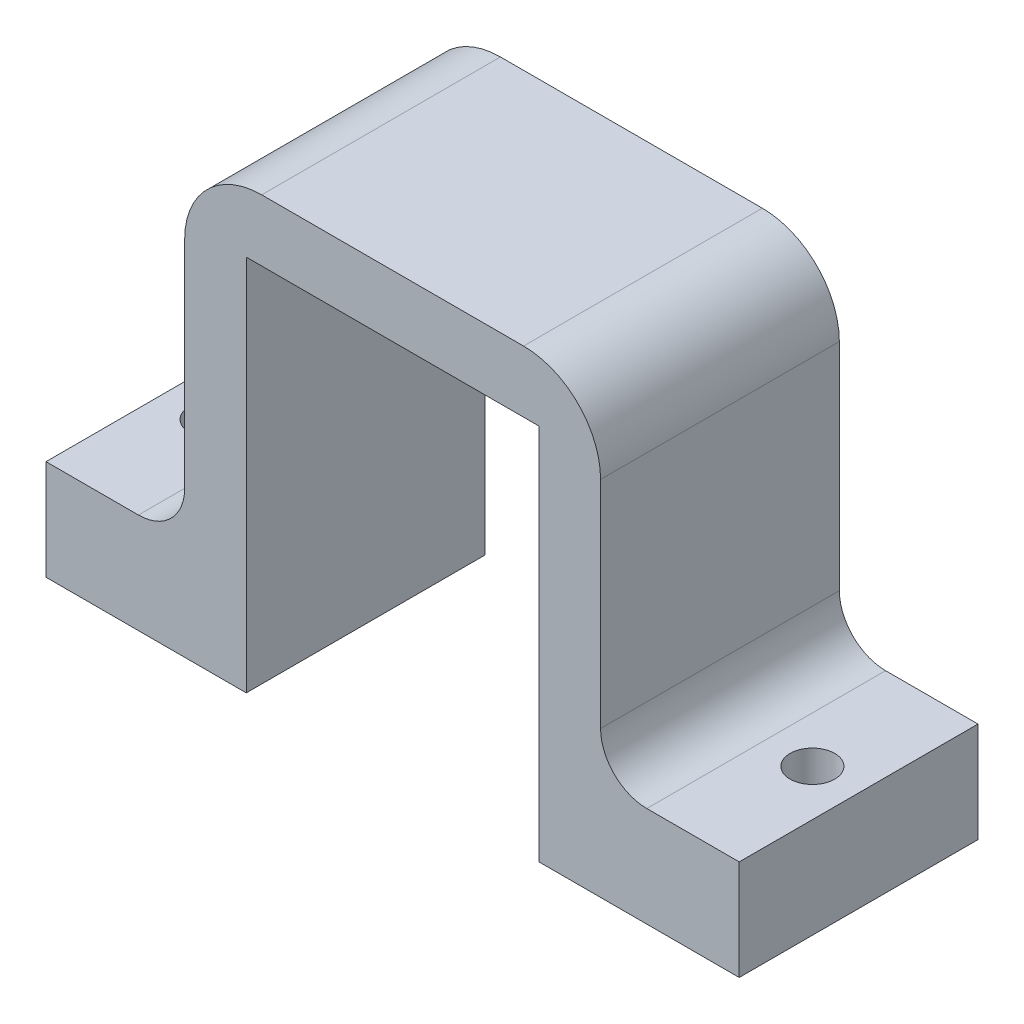
ISO-10303-21;
HEADER;
FILE_DESCRIPTION(('STEP AP214'),'2;1');
FILE_NAME('part.step','',(''),(''),'','','');
FILE_SCHEMA(('AUTOMOTIVE_DESIGN { 1 0 10303 214 1 1 1 1 }'));
ENDSEC;
DATA;
#1=APPLICATION_CONTEXT('core data for automotive mechanical design processes');
#2=APPLICATION_PROTOCOL_DEFINITION('international standard','automotive_design',2000,#1);
#3=PRODUCT_CONTEXT('',#1,'mechanical');
#4=PRODUCT('Part','Part','',(#3));
#5=PRODUCT_RELATED_PRODUCT_CATEGORY('part','',(#4));
#6=PRODUCT_DEFINITION_FORMATION('','',#4);
#7=PRODUCT_DEFINITION_CONTEXT('part definition',#1,'design');
#8=PRODUCT_DEFINITION('design','',#6,#7);
#9=PRODUCT_DEFINITION_SHAPE('','',#8);
#10=(LENGTH_UNIT() NAMED_UNIT(*) SI_UNIT(.MILLI.,.METRE.));
#11=(NAMED_UNIT(*) PLANE_ANGLE_UNIT() SI_UNIT($,.RADIAN.));
#12=(NAMED_UNIT(*) SI_UNIT($,.STERADIAN.) SOLID_ANGLE_UNIT());
#13=UNCERTAINTY_MEASURE_WITH_UNIT(LENGTH_MEASURE(1.E-05),#10,'distance_accuracy_value','');
#14=(GEOMETRIC_REPRESENTATION_CONTEXT(3) GLOBAL_UNCERTAINTY_ASSIGNED_CONTEXT((#13)) GLOBAL_UNIT_ASSIGNED_CONTEXT((#10,
#11,#12)) REPRESENTATION_CONTEXT('',''));
#15=CARTESIAN_POINT('',(0.,0.,0.));
#16=DIRECTION('',(0.,0.,1.));
#17=DIRECTION('',(1.,0.,0.));
#18=AXIS2_PLACEMENT_3D('',#15,#16,#17);
#19=CARTESIAN_POINT('',(0.,3.00000000000002,23.));
#20=DIRECTION('',(1.,0.,0.));
#21=DIRECTION('',(0.,0.,-1.));
#22=AXIS2_PLACEMENT_3D('',#19,#20,#21);
#23=PLANE('',#22);
#24=DIRECTION('',(0.,1.,0.));
#25=VECTOR('',#24,1.);
#26=CARTESIAN_POINT('',(0.,3.00000000000002,7.5));
#27=LINE('',#26,#25);
#28=CARTESIAN_POINT('',(0.,3.00000000000002,7.5));
#29=VERTEX_POINT('',#28);
#30=CARTESIAN_POINT('',(0.,17.,7.5));
#31=VERTEX_POINT('',#30);
#32=EDGE_CURVE('E254',#29,#31,#27,.T.);
#33=ORIENTED_EDGE('',*,*,#32,.F.);
#34=DIRECTION('',(0.,0.,-1.));
#35=VECTOR('',#34,1.);
#36=CARTESIAN_POINT('',(0.,3.00000000000002,23.));
#37=LINE('',#36,#35);
#38=CARTESIAN_POINT('',(0.,3.00000000000002,23.));
#39=VERTEX_POINT('',#38);
#40=EDGE_CURVE('E312',#39,#29,#37,.T.);
#41=ORIENTED_EDGE('',*,*,#40,.F.);
#42=DIRECTION('',(0.,-1.,0.));
#43=VECTOR('',#42,1.);
#44=CARTESIAN_POINT('',(0.,3.00000000000002,23.));
#45=LINE('',#44,#43);
#46=CARTESIAN_POINT('',(0.,17.,23.));
#47=VERTEX_POINT('',#46);
#48=EDGE_CURVE('E279',#47,#39,#45,.T.);
#49=ORIENTED_EDGE('',*,*,#48,.F.);
#50=DIRECTION('',(0.,0.,-1.));
#51=VECTOR('',#50,1.);
#52=CARTESIAN_POINT('',(0.,17.,23.));
#53=LINE('',#52,#51);
#54=EDGE_CURVE('E316',#47,#31,#53,.T.);
#55=ORIENTED_EDGE('',*,*,#54,.T.);
#56=EDGE_LOOP('',(#33,#41,#49,#55));
#57=FACE_BOUND('',#56,.T.);
#58=ADVANCED_FACE('F45',(#57),#23,.F.);
#59=CARTESIAN_POINT('',(-3.,3.,23.));
#60=DIRECTION('',(0.,0.,-1.));
#61=DIRECTION('',(-1.,0.,0.));
#62=AXIS2_PLACEMENT_3D('',#59,#60,#61);
#63=CYLINDRICAL_SURFACE('',#62,3.);
#64=CARTESIAN_POINT('',(-3.,3.,7.5));
#65=DIRECTION('',(0.,0.,-1.));
#66=DIRECTION('',(0.,1.,0.));
#67=AXIS2_PLACEMENT_3D('',#64,#65,#66);
#68=CIRCLE('',#67,3.);
#69=CARTESIAN_POINT('',(-3.00000000000002,0.,7.5));
#70=VERTEX_POINT('',#69);
#71=EDGE_CURVE('E251',#70,#29,#68,.F.);
#72=ORIENTED_EDGE('',*,*,#71,.F.);
#73=DIRECTION('',(0.,0.,-1.));
#74=VECTOR('',#73,1.);
#75=CARTESIAN_POINT('',(-3.00000000000002,0.,23.));
#76=LINE('',#75,#74);
#77=CARTESIAN_POINT('',(-3.00000000000002,0.,23.));
#78=VERTEX_POINT('',#77);
#79=EDGE_CURVE('E308',#78,#70,#76,.T.);
#80=ORIENTED_EDGE('',*,*,#79,.F.);
#81=CARTESIAN_POINT('',(-3.,3.,23.));
#82=DIRECTION('',(0.,0.,-1.));
#83=DIRECTION('',(-1.,0.,0.));
#84=AXIS2_PLACEMENT_3D('',#81,#82,#83);
#85=CIRCLE('',#84,3.);
#86=EDGE_CURVE('E282',#39,#78,#85,.T.);
#87=ORIENTED_EDGE('',*,*,#86,.F.);
#88=ORIENTED_EDGE('',*,*,#40,.T.);
#89=EDGE_LOOP('',(#72,#80,#87,#88));
#90=FACE_BOUND('',#89,.T.);
#91=ADVANCED_FACE('F367',(#90),#63,.F.);
#92=CARTESIAN_POINT('',(-9.,0.,23.));
#93=DIRECTION('',(0.,-1.,0.));
#94=DIRECTION('',(0.,0.,-1.));
#95=AXIS2_PLACEMENT_3D('',#92,#93,#94);
#96=PLANE('',#95);
#97=CARTESIAN_POINT('',(-6.00000000000001,0.,15.25));
#98=DIRECTION('',(0.,1.,0.));
#99=DIRECTION('',(0.,0.,1.));
#100=AXIS2_PLACEMENT_3D('',#97,#98,#99);
#101=CIRCLE('',#100,1.45);
#102=CARTESIAN_POINT('',(-6.00000000000001,0.,16.7));
#103=VERTEX_POINT('',#102);
#104=EDGE_CURVE('E213',#103,#103,#101,.T.);
#105=ORIENTED_EDGE('',*,*,#104,.F.);
#106=EDGE_LOOP('',(#105));
#107=FACE_BOUND('',#106,.T.);
#108=DIRECTION('',(1.,0.,0.));
#109=VECTOR('',#108,1.);
#110=CARTESIAN_POINT('',(-9.,0.,7.5));
#111=LINE('',#110,#109);
#112=CARTESIAN_POINT('',(-9.,0.,7.5));
#113=VERTEX_POINT('',#112);
#114=EDGE_CURVE('E248',#113,#70,#111,.T.);
#115=ORIENTED_EDGE('',*,*,#114,.F.);
#116=DIRECTION('',(0.,0.,-1.));
#117=VECTOR('',#116,1.);
#118=CARTESIAN_POINT('',(-9.,0.,23.));
#119=LINE('',#118,#117);
#120=CARTESIAN_POINT('',(-9.,0.,23.));
#121=VERTEX_POINT('',#120);
#122=EDGE_CURVE('E304',#121,#113,#119,.T.);
#123=ORIENTED_EDGE('',*,*,#122,.F.);
#124=DIRECTION('',(-1.,0.,0.));
#125=VECTOR('',#124,1.);
#126=CARTESIAN_POINT('',(-9.,0.,23.));
#127=LINE('',#126,#125);
#128=EDGE_CURVE('E285',#78,#121,#127,.T.);
#129=ORIENTED_EDGE('',*,*,#128,.F.);
#130=ORIENTED_EDGE('',*,*,#79,.T.);
#131=EDGE_LOOP('',(#115,#123,#129,#130));
#132=FACE_BOUND('',#131,.T.);
#133=ADVANCED_FACE('F374',(#107,#132),#96,.F.);
#134=CARTESIAN_POINT('',(-9.,-4.,23.));
#135=DIRECTION('',(1.,0.,0.));
#136=DIRECTION('',(0.,1.,0.));
#137=AXIS2_PLACEMENT_3D('',#134,#135,#136);
#138=PLANE('',#137);
#139=DIRECTION('',(0.,1.,0.));
#140=VECTOR('',#139,1.);
#141=CARTESIAN_POINT('',(-9.,-4.,7.5));
#142=LINE('',#141,#140);
#143=CARTESIAN_POINT('',(-8.99999999999999,-6.50000000000001,7.5));
#144=VERTEX_POINT('',#143);
#145=EDGE_CURVE('E245',#144,#113,#142,.T.);
#146=ORIENTED_EDGE('',*,*,#145,.F.);
#147=DIRECTION('',(0.,0.,-1.));
#148=VECTOR('',#147,1.);
#149=CARTESIAN_POINT('',(-8.99999999999999,-6.50000000000001,23.));
#150=LINE('',#149,#148);
#151=CARTESIAN_POINT('',(-8.99999999999999,-6.50000000000001,23.));
#152=VERTEX_POINT('',#151);
#153=EDGE_CURVE('E206',#152,#144,#150,.T.);
#154=ORIENTED_EDGE('',*,*,#153,.F.);
#155=DIRECTION('',(0.,-1.,0.));
#156=VECTOR('',#155,1.);
#157=CARTESIAN_POINT('',(-9.,-4.,23.));
#158=LINE('',#157,#156);
#159=EDGE_CURVE('E288',#121,#152,#158,.T.);
#160=ORIENTED_EDGE('',*,*,#159,.F.);
#161=ORIENTED_EDGE('',*,*,#122,.T.);
#162=EDGE_LOOP('',(#146,#154,#160,#161));
#163=FACE_BOUND('',#162,.T.);
#164=ADVANCED_FACE('F439',(#163),#138,.F.);
#165=CARTESIAN_POINT('',(4.,18.,23.));
#166=DIRECTION('',(-1.,0.,0.));
#167=DIRECTION('',(0.,-1.,0.));
#168=AXIS2_PLACEMENT_3D('',#165,#166,#167);
#169=PLANE('',#168);
#170=DIRECTION('',(0.,-1.,0.));
#171=VECTOR('',#170,1.);
#172=CARTESIAN_POINT('',(4.,18.,7.5));
#173=LINE('',#172,#171);
#174=CARTESIAN_POINT('',(4.,18.,7.5));
#175=VERTEX_POINT('',#174);
#176=CARTESIAN_POINT('',(4.,-6.50000000000001,7.5));
#177=VERTEX_POINT('',#176);
#178=EDGE_CURVE('E11',#175,#177,#173,.T.);
#179=ORIENTED_EDGE('',*,*,#178,.F.);
#180=DIRECTION('',(0.,0.,-1.));
#181=VECTOR('',#180,1.);
#182=CARTESIAN_POINT('',(4.,18.,23.));
#183=LINE('',#182,#181);
#184=CARTESIAN_POINT('',(4.,18.,23.));
#185=VERTEX_POINT('',#184);
#186=EDGE_CURVE('E300',#185,#175,#183,.T.);
#187=ORIENTED_EDGE('',*,*,#186,.F.);
#188=DIRECTION('',(0.,1.,0.));
#189=VECTOR('',#188,1.);
#190=CARTESIAN_POINT('',(4.,18.,23.));
#191=LINE('',#190,#189);
#192=CARTESIAN_POINT('',(4.,-6.50000000000001,23.));
#193=VERTEX_POINT('',#192);
#194=EDGE_CURVE('E68',#193,#185,#191,.T.);
#195=ORIENTED_EDGE('',*,*,#194,.F.);
#196=DIRECTION('',(0.,0.,1.));
#197=VECTOR('',#196,1.);
#198=CARTESIAN_POINT('',(4.,-6.50000000000001,23.));
#199=LINE('',#198,#197);
#200=EDGE_CURVE('E190',#177,#193,#199,.T.);
#201=ORIENTED_EDGE('',*,*,#200,.F.);
#202=EDGE_LOOP('',(#179,#187,#195,#201));
#203=FACE_BOUND('',#202,.T.);
#204=ADVANCED_FACE('F407',(#203),#169,.F.);
#205=CARTESIAN_POINT('',(36.,0.,23.));
#206=DIRECTION('',(-1.,0.,0.));
#207=DIRECTION('',(0.,0.,1.));
#208=AXIS2_PLACEMENT_3D('',#205,#206,#207);
#209=PLANE('',#208);
#210=DIRECTION('',(0.,1.,0.));
#211=VECTOR('',#210,1.);
#212=CARTESIAN_POINT('',(36.,0.,23.));
#213=LINE('',#212,#211);
#214=CARTESIAN_POINT('',(36.,-6.5,23.));
#215=VERTEX_POINT('',#214);
#216=CARTESIAN_POINT('',(36.,0.,23.));
#217=VERTEX_POINT('',#216);
#218=EDGE_CURVE('E257',#215,#217,#213,.T.);
#219=ORIENTED_EDGE('',*,*,#218,.F.);
#220=DIRECTION('',(0.,0.,1.));
#221=VECTOR('',#220,1.);
#222=CARTESIAN_POINT('',(36.,-6.5,23.));
#223=LINE('',#222,#221);
#224=CARTESIAN_POINT('',(36.,-6.5,7.5));
#225=VERTEX_POINT('',#224);
#226=EDGE_CURVE('E183',#225,#215,#223,.T.);
#227=ORIENTED_EDGE('',*,*,#226,.F.);
#228=DIRECTION('',(0.,1.,0.));
#229=VECTOR('',#228,1.);
#230=CARTESIAN_POINT('',(36.,-4.00000000000001,7.5));
#231=LINE('',#230,#229);
#232=CARTESIAN_POINT('',(36.,0.,7.5));
#233=VERTEX_POINT('',#232);
#234=EDGE_CURVE('E178',#225,#233,#231,.T.);
#235=ORIENTED_EDGE('',*,*,#234,.T.);
#236=DIRECTION('',(0.,0.,-1.));
#237=VECTOR('',#236,1.);
#238=CARTESIAN_POINT('',(36.,0.,23.));
#239=LINE('',#238,#237);
#240=EDGE_CURVE('E55',#217,#233,#239,.T.);
#241=ORIENTED_EDGE('',*,*,#240,.F.);
#242=EDGE_LOOP('',(#219,#227,#235,#241));
#243=FACE_BOUND('',#242,.T.);
#244=ADVANCED_FACE('F47',(#243),#209,.F.);
#245=CARTESIAN_POINT('',(30.,0.,23.));
#246=DIRECTION('',(0.,-1.,0.));
#247=DIRECTION('',(0.,0.,-1.));
#248=AXIS2_PLACEMENT_3D('',#245,#246,#247);
#249=PLANE('',#248);
#250=CARTESIAN_POINT('',(33.,0.,15.25));
#251=DIRECTION('',(0.,1.,0.));
#252=DIRECTION('',(0.,0.,-1.));
#253=AXIS2_PLACEMENT_3D('',#250,#251,#252);
#254=CIRCLE('',#253,1.45);
#255=CARTESIAN_POINT('',(33.,0.,13.8));
#256=VERTEX_POINT('',#255);
#257=EDGE_CURVE('E201',#256,#256,#254,.T.);
#258=ORIENTED_EDGE('',*,*,#257,.F.);
#259=EDGE_LOOP('',(#258));
#260=FACE_BOUND('',#259,.T.);
#261=ORIENTED_EDGE('',*,*,#240,.T.);
#262=DIRECTION('',(-1.,0.,0.));
#263=VECTOR('',#262,1.);
#264=CARTESIAN_POINT('',(30.,0.,7.5));
#265=LINE('',#264,#263);
#266=CARTESIAN_POINT('',(30.,0.,7.5));
#267=VERTEX_POINT('',#266);
#268=EDGE_CURVE('E241',#233,#267,#265,.T.);
#269=ORIENTED_EDGE('',*,*,#268,.T.);
#270=DIRECTION('',(0.,0.,-1.));
#271=VECTOR('',#270,1.);
#272=CARTESIAN_POINT('',(30.,0.,23.));
#273=LINE('',#272,#271);
#274=CARTESIAN_POINT('',(30.,0.,23.));
#275=VERTEX_POINT('',#274);
#276=EDGE_CURVE('E336',#275,#267,#273,.T.);
#277=ORIENTED_EDGE('',*,*,#276,.F.);
#278=DIRECTION('',(-1.,0.,0.));
#279=VECTOR('',#278,1.);
#280=CARTESIAN_POINT('',(30.,0.,23.));
#281=LINE('',#280,#279);
#282=EDGE_CURVE('E261',#217,#275,#281,.T.);
#283=ORIENTED_EDGE('',*,*,#282,.F.);
#284=EDGE_LOOP('',(#261,#269,#277,#283));
#285=FACE_BOUND('',#284,.T.);
#286=ADVANCED_FACE('F398',(#260,#285),#249,.F.);
#287=CARTESIAN_POINT('',(30.,3.,23.));
#288=DIRECTION('',(0.,0.,-1.));
#289=DIRECTION('',(-1.,0.,0.));
#290=AXIS2_PLACEMENT_3D('',#287,#288,#289);
#291=CYLINDRICAL_SURFACE('',#290,3.);
#292=ORIENTED_EDGE('',*,*,#276,.T.);
#293=CARTESIAN_POINT('',(30.,3.,7.5));
#294=DIRECTION('',(0.,0.,1.));
#295=DIRECTION('',(1.,0.,0.));
#296=AXIS2_PLACEMENT_3D('',#293,#294,#295);
#297=CIRCLE('',#296,3.);
#298=CARTESIAN_POINT('',(27.,3.,7.5));
#299=VERTEX_POINT('',#298);
#300=EDGE_CURVE('E237',#267,#299,#297,.F.);
#301=ORIENTED_EDGE('',*,*,#300,.T.);
#302=DIRECTION('',(0.,0.,-1.));
#303=VECTOR('',#302,1.);
#304=CARTESIAN_POINT('',(27.,3.,23.));
#305=LINE('',#304,#303);
#306=CARTESIAN_POINT('',(27.,3.,23.));
#307=VERTEX_POINT('',#306);
#308=EDGE_CURVE('E332',#307,#299,#305,.T.);
#309=ORIENTED_EDGE('',*,*,#308,.F.);
#310=CARTESIAN_POINT('',(30.,3.,23.));
#311=DIRECTION('',(0.,0.,-1.));
#312=DIRECTION('',(-1.,0.,0.));
#313=AXIS2_PLACEMENT_3D('',#310,#311,#312);
#314=CIRCLE('',#313,3.);
#315=EDGE_CURVE('E264',#275,#307,#314,.T.);
#316=ORIENTED_EDGE('',*,*,#315,.F.);
#317=EDGE_LOOP('',(#292,#301,#309,#316));
#318=FACE_BOUND('',#317,.T.);
#319=ADVANCED_FACE('F396',(#318),#291,.F.);
#320=CARTESIAN_POINT('',(27.,17.,23.));
#321=DIRECTION('',(-1.,0.,0.));
#322=DIRECTION('',(0.,-1.,0.));
#323=AXIS2_PLACEMENT_3D('',#320,#321,#322);
#324=PLANE('',#323);
#325=ORIENTED_EDGE('',*,*,#308,.T.);
#326=DIRECTION('',(0.,1.,0.));
#327=VECTOR('',#326,1.);
#328=CARTESIAN_POINT('',(27.,17.,7.5));
#329=LINE('',#328,#327);
#330=CARTESIAN_POINT('',(27.,17.,7.5));
#331=VERTEX_POINT('',#330);
#332=EDGE_CURVE('E233',#299,#331,#329,.T.);
#333=ORIENTED_EDGE('',*,*,#332,.T.);
#334=DIRECTION('',(0.,0.,-1.));
#335=VECTOR('',#334,1.);
#336=CARTESIAN_POINT('',(27.,17.,23.));
#337=LINE('',#336,#335);
#338=CARTESIAN_POINT('',(27.,17.,23.));
#339=VERTEX_POINT('',#338);
#340=EDGE_CURVE('E328',#339,#331,#337,.T.);
#341=ORIENTED_EDGE('',*,*,#340,.F.);
#342=DIRECTION('',(0.,1.,0.));
#343=VECTOR('',#342,1.);
#344=CARTESIAN_POINT('',(27.,17.,23.));
#345=LINE('',#344,#343);
#346=EDGE_CURVE('E267',#307,#339,#345,.T.);
#347=ORIENTED_EDGE('',*,*,#346,.F.);
#348=EDGE_LOOP('',(#325,#333,#341,#347));
#349=FACE_BOUND('',#348,.T.);
#350=ADVANCED_FACE('F392',(#349),#324,.F.);
#351=CARTESIAN_POINT('',(22.,17.,23.));
#352=DIRECTION('',(0.,0.,-1.));
#353=DIRECTION('',(-1.,0.,0.));
#354=AXIS2_PLACEMENT_3D('',#351,#352,#353);
#355=CYLINDRICAL_SURFACE('',#354,5.);
#356=ORIENTED_EDGE('',*,*,#340,.T.);
#357=CARTESIAN_POINT('',(22.,17.,7.5));
#358=DIRECTION('',(0.,0.,1.));
#359=DIRECTION('',(1.,0.,0.));
#360=AXIS2_PLACEMENT_3D('',#357,#358,#359);
#361=CIRCLE('',#360,5.);
#362=CARTESIAN_POINT('',(22.,22.,7.5));
#363=VERTEX_POINT('',#362);
#364=EDGE_CURVE('E170',#331,#363,#361,.T.);
#365=ORIENTED_EDGE('',*,*,#364,.T.);
#366=DIRECTION('',(0.,0.,-1.));
#367=VECTOR('',#366,1.);
#368=CARTESIAN_POINT('',(22.,22.,23.));
#369=LINE('',#368,#367);
#370=CARTESIAN_POINT('',(22.,22.,23.));
#371=VERTEX_POINT('',#370);
#372=EDGE_CURVE('E324',#371,#363,#369,.T.);
#373=ORIENTED_EDGE('',*,*,#372,.F.);
#374=CARTESIAN_POINT('',(22.,17.,23.));
#375=DIRECTION('',(0.,0.,1.));
#376=DIRECTION('',(-1.,0.,0.));
#377=AXIS2_PLACEMENT_3D('',#374,#375,#376);
#378=CIRCLE('',#377,5.);
#379=EDGE_CURVE('E270',#339,#371,#378,.T.);
#380=ORIENTED_EDGE('',*,*,#379,.F.);
#381=EDGE_LOOP('',(#356,#365,#373,#380));
#382=FACE_BOUND('',#381,.T.);
#383=ADVANCED_FACE('F388',(#382),#355,.T.);
#384=CARTESIAN_POINT('',(5.00000000000004,22.,23.));
#385=DIRECTION('',(0.,-1.,0.));
#386=DIRECTION('',(0.,0.,-1.));
#387=AXIS2_PLACEMENT_3D('',#384,#385,#386);
#388=PLANE('',#387);
#389=ORIENTED_EDGE('',*,*,#372,.T.);
#390=DIRECTION('',(1.,0.,0.));
#391=VECTOR('',#390,1.);
#392=CARTESIAN_POINT('',(-9.,22.,7.5));
#393=LINE('',#392,#391);
#394=CARTESIAN_POINT('',(5.,22.,7.5));
#395=VERTEX_POINT('',#394);
#396=EDGE_CURVE('E217',#395,#363,#393,.T.);
#397=ORIENTED_EDGE('',*,*,#396,.F.);
#398=DIRECTION('',(0.,0.,-1.));
#399=VECTOR('',#398,1.);
#400=CARTESIAN_POINT('',(5.00000000000004,22.,23.));
#401=LINE('',#400,#399);
#402=CARTESIAN_POINT('',(5.00000000000004,22.,23.));
#403=VERTEX_POINT('',#402);
#404=EDGE_CURVE('E320',#403,#395,#401,.T.);
#405=ORIENTED_EDGE('',*,*,#404,.F.);
#406=DIRECTION('',(-1.,0.,0.));
#407=VECTOR('',#406,1.);
#408=CARTESIAN_POINT('',(5.00000000000004,22.,23.));
#409=LINE('',#408,#407);
#410=EDGE_CURVE('E273',#371,#403,#409,.T.);
#411=ORIENTED_EDGE('',*,*,#410,.F.);
#412=EDGE_LOOP('',(#389,#397,#405,#411));
#413=FACE_BOUND('',#412,.T.);
#414=ADVANCED_FACE('F384',(#413),#388,.F.);
#415=CARTESIAN_POINT('',(5.,17.,23.));
#416=DIRECTION('',(0.,0.,-1.));
#417=DIRECTION('',(-1.,0.,0.));
#418=AXIS2_PLACEMENT_3D('',#415,#416,#417);
#419=CYLINDRICAL_SURFACE('',#418,5.);
#420=ORIENTED_EDGE('',*,*,#404,.T.);
#421=CARTESIAN_POINT('',(5.,17.,7.5));
#422=DIRECTION('',(0.,0.,1.));
#423=DIRECTION('',(1.,0.,0.));
#424=AXIS2_PLACEMENT_3D('',#421,#422,#423);
#425=CIRCLE('',#424,5.);
#426=EDGE_CURVE('E225',#395,#31,#425,.T.);
#427=ORIENTED_EDGE('',*,*,#426,.T.);
#428=ORIENTED_EDGE('',*,*,#54,.F.);
#429=CARTESIAN_POINT('',(5.,17.,23.));
#430=DIRECTION('',(0.,0.,1.));
#431=DIRECTION('',(1.,0.,0.));
#432=AXIS2_PLACEMENT_3D('',#429,#430,#431);
#433=CIRCLE('',#432,5.);
#434=EDGE_CURVE('E276',#403,#47,#433,.T.);
#435=ORIENTED_EDGE('',*,*,#434,.F.);
#436=EDGE_LOOP('',(#420,#427,#428,#435));
#437=FACE_BOUND('',#436,.T.);
#438=ADVANCED_FACE('F380',(#437),#419,.T.);
#439=CARTESIAN_POINT('',(23.,18.,23.));
#440=DIRECTION('',(0.,1.,0.));
#441=DIRECTION('',(-1.,0.,0.));
#442=AXIS2_PLACEMENT_3D('',#439,#440,#441);
#443=PLANE('',#442);
#444=ORIENTED_EDGE('',*,*,#186,.T.);
#445=DIRECTION('',(1.,0.,0.));
#446=VECTOR('',#445,1.);
#447=CARTESIAN_POINT('',(23.,18.,7.5));
#448=LINE('',#447,#446);
#449=CARTESIAN_POINT('',(23.,18.,7.5));
#450=VERTEX_POINT('',#449);
#451=EDGE_CURVE('E171',#175,#450,#448,.T.);
#452=ORIENTED_EDGE('',*,*,#451,.T.);
#453=DIRECTION('',(0.,0.,-1.));
#454=VECTOR('',#453,1.);
#455=CARTESIAN_POINT('',(23.,18.,23.));
#456=LINE('',#455,#454);
#457=CARTESIAN_POINT('',(23.,18.,23.));
#458=VERTEX_POINT('',#457);
#459=EDGE_CURVE('E165',#458,#450,#456,.T.);
#460=ORIENTED_EDGE('',*,*,#459,.F.);
#461=DIRECTION('',(1.,0.,0.));
#462=VECTOR('',#461,1.);
#463=CARTESIAN_POINT('',(23.,18.,23.));
#464=LINE('',#463,#462);
#465=EDGE_CURVE('E63',#185,#458,#464,.T.);
#466=ORIENTED_EDGE('',*,*,#465,.F.);
#467=EDGE_LOOP('',(#444,#452,#460,#466));
#468=FACE_BOUND('',#467,.T.);
#469=ADVANCED_FACE('F383',(#468),#443,.F.);
#470=CARTESIAN_POINT('',(23.,-4.,23.));
#471=DIRECTION('',(1.,0.,0.));
#472=DIRECTION('',(0.,0.,-1.));
#473=AXIS2_PLACEMENT_3D('',#470,#471,#472);
#474=PLANE('',#473);
#475=ORIENTED_EDGE('',*,*,#459,.T.);
#476=DIRECTION('',(0.,-1.,0.));
#477=VECTOR('',#476,1.);
#478=CARTESIAN_POINT('',(23.,-4.,7.5));
#479=LINE('',#478,#477);
#480=CARTESIAN_POINT('',(23.,-6.5,7.5));
#481=VERTEX_POINT('',#480);
#482=EDGE_CURVE('E159',#450,#481,#479,.T.);
#483=ORIENTED_EDGE('',*,*,#482,.T.);
#484=DIRECTION('',(0.,0.,-1.));
#485=VECTOR('',#484,1.);
#486=CARTESIAN_POINT('',(23.,-6.5,23.));
#487=LINE('',#486,#485);
#488=CARTESIAN_POINT('',(23.,-6.5,23.));
#489=VERTEX_POINT('',#488);
#490=EDGE_CURVE('E164',#489,#481,#487,.T.);
#491=ORIENTED_EDGE('',*,*,#490,.F.);
#492=DIRECTION('',(0.,-1.,0.));
#493=VECTOR('',#492,1.);
#494=CARTESIAN_POINT('',(23.,-4.,23.));
#495=LINE('',#494,#493);
#496=EDGE_CURVE('E295',#458,#489,#495,.T.);
#497=ORIENTED_EDGE('',*,*,#496,.F.);
#498=EDGE_LOOP('',(#475,#483,#491,#497));
#499=FACE_BOUND('',#498,.T.);
#500=ADVANCED_FACE('F161',(#499),#474,.F.);
#501=CARTESIAN_POINT('',(-3.,3.,23.));
#502=DIRECTION('',(0.,0.,-1.));
#503=DIRECTION('',(-1.,0.,0.));
#504=AXIS2_PLACEMENT_3D('',#501,#502,#503);
#505=PLANE('',#504);
#506=ORIENTED_EDGE('',*,*,#218,.T.);
#507=ORIENTED_EDGE('',*,*,#282,.T.);
#508=ORIENTED_EDGE('',*,*,#315,.T.);
#509=ORIENTED_EDGE('',*,*,#346,.T.);
#510=ORIENTED_EDGE('',*,*,#379,.T.);
#511=ORIENTED_EDGE('',*,*,#410,.T.);
#512=ORIENTED_EDGE('',*,*,#434,.T.);
#513=ORIENTED_EDGE('',*,*,#48,.T.);
#514=ORIENTED_EDGE('',*,*,#86,.T.);
#515=ORIENTED_EDGE('',*,*,#128,.T.);
#516=ORIENTED_EDGE('',*,*,#159,.T.);
#517=DIRECTION('',(-1.,0.,0.));
#518=VECTOR('',#517,1.);
#519=CARTESIAN_POINT('',(4.,-6.50000000000001,23.));
#520=LINE('',#519,#518);
#521=EDGE_CURVE('E194',#193,#152,#520,.T.);
#522=ORIENTED_EDGE('',*,*,#521,.F.);
#523=ORIENTED_EDGE('',*,*,#194,.T.);
#524=ORIENTED_EDGE('',*,*,#465,.T.);
#525=ORIENTED_EDGE('',*,*,#496,.T.);
#526=DIRECTION('',(-1.,0.,0.));
#527=VECTOR('',#526,1.);
#528=CARTESIAN_POINT('',(23.,-6.5,23.));
#529=LINE('',#528,#527);
#530=EDGE_CURVE('E188',#215,#489,#529,.T.);
#531=ORIENTED_EDGE('',*,*,#530,.F.);
#532=EDGE_LOOP('',(#506,#507,#508,#509,#510,#511,#512,#513,#514,#515,#516,#522,#523,#524,#525,#531));
#533=FACE_BOUND('',#532,.T.);
#534=ADVANCED_FACE('F413',(#533),#505,.F.);
#535=CARTESIAN_POINT('',(-23.,17.,7.5));
#536=DIRECTION('',(0.,0.,-1.));
#537=DIRECTION('',(0.,1.,0.));
#538=AXIS2_PLACEMENT_3D('',#535,#536,#537);
#539=PLANE('',#538);
#540=ORIENTED_EDGE('',*,*,#32,.T.);
#541=ORIENTED_EDGE('',*,*,#426,.F.);
#542=ORIENTED_EDGE('',*,*,#396,.T.);
#543=ORIENTED_EDGE('',*,*,#364,.F.);
#544=ORIENTED_EDGE('',*,*,#332,.F.);
#545=ORIENTED_EDGE('',*,*,#300,.F.);
#546=ORIENTED_EDGE('',*,*,#268,.F.);
#547=ORIENTED_EDGE('',*,*,#234,.F.);
#548=DIRECTION('',(1.,0.,0.));
#549=VECTOR('',#548,1.);
#550=CARTESIAN_POINT('',(23.,-6.5,7.5));
#551=LINE('',#550,#549);
#552=EDGE_CURVE('E174',#481,#225,#551,.T.);
#553=ORIENTED_EDGE('',*,*,#552,.F.);
#554=ORIENTED_EDGE('',*,*,#482,.F.);
#555=ORIENTED_EDGE('',*,*,#451,.F.);
#556=ORIENTED_EDGE('',*,*,#178,.T.);
#557=DIRECTION('',(1.,0.,0.));
#558=VECTOR('',#557,1.);
#559=CARTESIAN_POINT('',(4.,-6.50000000000001,7.5));
#560=LINE('',#559,#558);
#561=EDGE_CURVE('E202',#144,#177,#560,.T.);
#562=ORIENTED_EDGE('',*,*,#561,.F.);
#563=ORIENTED_EDGE('',*,*,#145,.T.);
#564=ORIENTED_EDGE('',*,*,#114,.T.);
#565=ORIENTED_EDGE('',*,*,#71,.T.);
#566=EDGE_LOOP('',(#540,#541,#542,#543,#544,#545,#546,#547,#553,#554,#555,#556,#562,#563,#564,#565));
#567=FACE_BOUND('',#566,.T.);
#568=ADVANCED_FACE('F176',(#567),#539,.T.);
#569=CARTESIAN_POINT('',(33.,-50.,15.25));
#570=DIRECTION('',(0.,1.,0.));
#571=DIRECTION('',(0.,0.,1.));
#572=AXIS2_PLACEMENT_3D('',#569,#570,#571);
#573=CYLINDRICAL_SURFACE('',#572,1.45);
#574=ORIENTED_EDGE('',*,*,#257,.T.);
#575=EDGE_LOOP('',(#574));
#576=FACE_BOUND('',#575,.T.);
#577=CARTESIAN_POINT('',(33.,-6.5,15.25));
#578=DIRECTION('',(0.,-1.,0.));
#579=DIRECTION('',(1.,0.,0.));
#580=AXIS2_PLACEMENT_3D('',#577,#578,#579);
#581=CIRCLE('',#580,1.45);
#582=CARTESIAN_POINT('',(34.45,-6.5,15.25));
#583=VERTEX_POINT('',#582);
#584=EDGE_CURVE('E342',#583,#583,#581,.T.);
#585=ORIENTED_EDGE('',*,*,#584,.T.);
#586=EDGE_LOOP('',(#585));
#587=FACE_BOUND('',#586,.T.);
#588=ADVANCED_FACE('F356',(#576,#587),#573,.F.);
#589=CARTESIAN_POINT('',(-6.00000000000001,-50.,15.25));
#590=DIRECTION('',(0.,1.,0.));
#591=DIRECTION('',(0.,0.,1.));
#592=AXIS2_PLACEMENT_3D('',#589,#590,#591);
#593=CYLINDRICAL_SURFACE('',#592,1.45);
#594=ORIENTED_EDGE('',*,*,#104,.T.);
#595=EDGE_LOOP('',(#594));
#596=FACE_BOUND('',#595,.T.);
#597=CARTESIAN_POINT('',(-6.,-6.50000000000001,15.25));
#598=DIRECTION('',(0.,1.,0.));
#599=DIRECTION('',(-1.,0.,0.));
#600=AXIS2_PLACEMENT_3D('',#597,#598,#599);
#601=CIRCLE('',#600,1.45);
#602=CARTESIAN_POINT('',(-7.45,-6.50000000000001,15.25));
#603=VERTEX_POINT('',#602);
#604=EDGE_CURVE('E49',#603,#603,#601,.T.);
#605=ORIENTED_EDGE('',*,*,#604,.F.);
#606=EDGE_LOOP('',(#605));
#607=FACE_BOUND('',#606,.T.);
#608=ADVANCED_FACE('F354',(#596,#607),#593,.F.);
#609=CARTESIAN_POINT('',(0.,-6.50000000000001,0.));
#610=DIRECTION('',(0.,1.,0.));
#611=DIRECTION('',(-1.,0.,0.));
#612=AXIS2_PLACEMENT_3D('',#609,#610,#611);
#613=PLANE('',#612);
#614=ORIENTED_EDGE('',*,*,#604,.T.);
#615=EDGE_LOOP('',(#614));
#616=FACE_BOUND('',#615,.T.);
#617=ORIENTED_EDGE('',*,*,#200,.T.);
#618=ORIENTED_EDGE('',*,*,#521,.T.);
#619=ORIENTED_EDGE('',*,*,#153,.T.);
#620=ORIENTED_EDGE('',*,*,#561,.T.);
#621=EDGE_LOOP('',(#617,#618,#619,#620));
#622=FACE_BOUND('',#621,.T.);
#623=ADVANCED_FACE('F351',(#616,#622),#613,.F.);
#624=CARTESIAN_POINT('',(0.,-6.50000000000001,0.));
#625=DIRECTION('',(0.,-1.,0.));
#626=DIRECTION('',(1.,0.,0.));
#627=AXIS2_PLACEMENT_3D('',#624,#625,#626);
#628=PLANE('',#627);
#629=ORIENTED_EDGE('',*,*,#584,.F.);
#630=EDGE_LOOP('',(#629));
#631=FACE_BOUND('',#630,.T.);
#632=ORIENTED_EDGE('',*,*,#490,.T.);
#633=ORIENTED_EDGE('',*,*,#552,.T.);
#634=ORIENTED_EDGE('',*,*,#226,.T.);
#635=ORIENTED_EDGE('',*,*,#530,.T.);
#636=EDGE_LOOP('',(#632,#633,#634,#635));
#637=FACE_BOUND('',#636,.T.);
#638=ADVANCED_FACE('F186',(#631,#637),#628,.T.);
#639=CLOSED_SHELL('',(#58,#91,#133,#164,#204,#244,#286,#319,#350,#383,#414,#438,#469,#500,#534,
#568,#588,#608,#623,#638));
#640=MANIFOLD_SOLID_BREP('B2',#639);
#641=ADVANCED_BREP_SHAPE_REPRESENTATION('',(#18,#640),#14);
#642=SHAPE_DEFINITION_REPRESENTATION(#9,#641);
ENDSEC;
END-ISO-10303-21;
